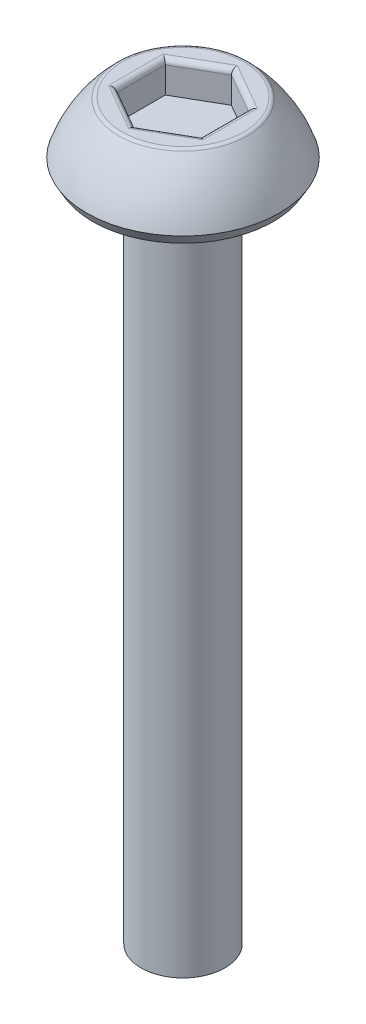
ISO-10303-21;
HEADER;
FILE_DESCRIPTION(('STEP AP214'),'2;1');
FILE_NAME('part.step','',(''),(''),'','','');
FILE_SCHEMA(('AUTOMOTIVE_DESIGN { 1 0 10303 214 1 1 1 1 }'));
ENDSEC;
DATA;
#1=APPLICATION_CONTEXT('core data for automotive mechanical design processes');
#2=APPLICATION_PROTOCOL_DEFINITION('international standard','automotive_design',2000,#1);
#3=PRODUCT_CONTEXT('',#1,'mechanical');
#4=PRODUCT('Part','Part','',(#3));
#5=PRODUCT_RELATED_PRODUCT_CATEGORY('part','',(#4));
#6=PRODUCT_DEFINITION_FORMATION('','',#4);
#7=PRODUCT_DEFINITION_CONTEXT('part definition',#1,'design');
#8=PRODUCT_DEFINITION('design','',#6,#7);
#9=PRODUCT_DEFINITION_SHAPE('','',#8);
#10=(LENGTH_UNIT() NAMED_UNIT(*) SI_UNIT(.MILLI.,.METRE.));
#11=(NAMED_UNIT(*) PLANE_ANGLE_UNIT() SI_UNIT($,.RADIAN.));
#12=(NAMED_UNIT(*) SI_UNIT($,.STERADIAN.) SOLID_ANGLE_UNIT());
#13=UNCERTAINTY_MEASURE_WITH_UNIT(LENGTH_MEASURE(1.E-05),#10,'distance_accuracy_value','');
#14=(GEOMETRIC_REPRESENTATION_CONTEXT(3) GLOBAL_UNCERTAINTY_ASSIGNED_CONTEXT((#13)) GLOBAL_UNIT_ASSIGNED_CONTEXT((#10,
#11,#12)) REPRESENTATION_CONTEXT('',''));
#15=CARTESIAN_POINT('',(0.,0.,0.));
#16=DIRECTION('',(0.,0.,1.));
#17=DIRECTION('',(1.,0.,0.));
#18=AXIS2_PLACEMENT_3D('',#15,#16,#17);
#19=CARTESIAN_POINT('',(0.,1.5,0.));
#20=DIRECTION('',(0.,-1.,0.));
#21=DIRECTION('',(0.,0.,-1.));
#22=AXIS2_PLACEMENT_3D('',#19,#20,#21);
#23=PLANE('',#22);
#24=CARTESIAN_POINT('',(0.,1.5,0.));
#25=DIRECTION('',(0.,-1.,0.));
#26=DIRECTION('',(0.,0.,-1.));
#27=AXIS2_PLACEMENT_3D('',#24,#25,#26);
#28=CIRCLE('',#27,1.45007695941143);
#29=CARTESIAN_POINT('',(0.,1.5,-1.45007695941143));
#30=VERTEX_POINT('',#29);
#31=EDGE_CURVE('E177',#30,#30,#28,.F.);
#32=ORIENTED_EDGE('',*,*,#31,.T.);
#33=EDGE_LOOP('',(#32));
#34=FACE_BOUND('',#33,.T.);
#35=DIRECTION('',(0.866025403784439,0.,-0.5));
#36=VECTOR('',#35,1.);
#37=CARTESIAN_POINT('',(0.5625,1.5,0.974278579257493));
#38=LINE('',#37,#36);
#39=CARTESIAN_POINT('',(1.125,1.5,0.649519052838329));
#40=VERTEX_POINT('',#39);
#41=CARTESIAN_POINT('',(0.,1.5,1.29903810567666));
#42=VERTEX_POINT('',#41);
#43=EDGE_CURVE('E172',#40,#42,#38,.F.);
#44=ORIENTED_EDGE('',*,*,#43,.T.);
#45=DIRECTION('',(0.866025403784439,0.,0.5));
#46=VECTOR('',#45,1.);
#47=CARTESIAN_POINT('',(-0.5625,1.5,0.974278579257493));
#48=LINE('',#47,#46);
#49=CARTESIAN_POINT('',(-1.125,1.5,0.649519052838329));
#50=VERTEX_POINT('',#49);
#51=EDGE_CURVE('E174',#42,#50,#48,.F.);
#52=ORIENTED_EDGE('',*,*,#51,.T.);
#53=DIRECTION('',(0.,0.,1.));
#54=VECTOR('',#53,1.);
#55=CARTESIAN_POINT('',(-1.125,1.5,0.));
#56=LINE('',#55,#54);
#57=CARTESIAN_POINT('',(-1.125,1.5,-0.649519052838329));
#58=VERTEX_POINT('',#57);
#59=EDGE_CURVE('E164',#50,#58,#56,.F.);
#60=ORIENTED_EDGE('',*,*,#59,.T.);
#61=DIRECTION('',(-0.866025403784439,0.,0.5));
#62=VECTOR('',#61,1.);
#63=CARTESIAN_POINT('',(-0.5625,1.5,-0.974278579257493));
#64=LINE('',#63,#62);
#65=CARTESIAN_POINT('',(0.,1.5,-1.29903810567666));
#66=VERTEX_POINT('',#65);
#67=EDGE_CURVE('E166',#58,#66,#64,.F.);
#68=ORIENTED_EDGE('',*,*,#67,.T.);
#69=DIRECTION('',(-0.866025403784439,0.,-0.5));
#70=VECTOR('',#69,1.);
#71=CARTESIAN_POINT('',(0.5625,1.5,-0.974278579257494));
#72=LINE('',#71,#70);
#73=CARTESIAN_POINT('',(1.125,1.5,-0.64951905283833));
#74=VERTEX_POINT('',#73);
#75=EDGE_CURVE('E168',#66,#74,#72,.F.);
#76=ORIENTED_EDGE('',*,*,#75,.T.);
#77=DIRECTION('',(0.,0.,-1.));
#78=VECTOR('',#77,1.);
#79=CARTESIAN_POINT('',(1.125,1.5,0.));
#80=LINE('',#79,#78);
#81=EDGE_CURVE('E170',#74,#40,#80,.F.);
#82=ORIENTED_EDGE('',*,*,#81,.T.);
#83=EDGE_LOOP('',(#44,#52,#60,#68,#76,#82));
#84=FACE_BOUND('',#83,.T.);
#85=ADVANCED_FACE('F35',(#34,#84),#23,.F.);
#86=CARTESIAN_POINT('',(0.,-0.691910970237067,0.));
#87=DIRECTION('',(0.,-1.,0.));
#88=DIRECTION('',(0.,0.,-1.));
#89=AXIS2_PLACEMENT_3D('',#86,#87,#88);
#90=DEGENERATE_TOROIDAL_SURFACE('',#89,0.548298390995416,3.,.F.);
#91=CARTESIAN_POINT('',(0.,1.46486569435813,0.));
#92=DIRECTION('',(0.,-1.,0.));
#93=DIRECTION('',(0.,0.,-1.));
#94=AXIS2_PLACEMENT_3D('',#91,#92,#93);
#95=CIRCLE('',#94,1.53696284421173);
#96=CARTESIAN_POINT('',(0.,1.46486569435813,-1.53696284421173));
#97=VERTEX_POINT('',#96);
#98=EDGE_CURVE('E161',#97,#97,#95,.T.);
#99=ORIENTED_EDGE('',*,*,#98,.T.);
#100=EDGE_LOOP('',(#99));
#101=FACE_BOUND('',#100,.T.);
#102=CARTESIAN_POINT('',(0.,0.25,0.));
#103=DIRECTION('',(0.,-1.,0.));
#104=DIRECTION('',(0.,0.,-1.));
#105=AXIS2_PLACEMENT_3D('',#102,#103,#104);
#106=CIRCLE('',#105,2.3);
#107=CARTESIAN_POINT('',(0.,0.25,-2.3));
#108=VERTEX_POINT('',#107);
#109=EDGE_CURVE('E158',#108,#108,#106,.T.);
#110=ORIENTED_EDGE('',*,*,#109,.F.);
#111=EDGE_LOOP('',(#110));
#112=FACE_BOUND('',#111,.T.);
#113=ADVANCED_FACE('F244',(#101,#112),#90,.F.);
#114=CARTESIAN_POINT('',(0.,0.25,0.));
#115=DIRECTION('',(0.,1.,0.));
#116=DIRECTION('',(0.,0.,1.));
#117=AXIS2_PLACEMENT_3D('',#114,#115,#116);
#118=CONICAL_SURFACE('',#117,2.3,0.523598775598296);
#119=CARTESIAN_POINT('',(0.,0.,0.));
#120=DIRECTION('',(0.,-1.,0.));
#121=DIRECTION('',(0.,0.,-1.));
#122=AXIS2_PLACEMENT_3D('',#119,#120,#121);
#123=CIRCLE('',#122,2.15566243270259);
#124=CARTESIAN_POINT('',(0.,0.,-2.15566243270259));
#125=VERTEX_POINT('',#124);
#126=EDGE_CURVE('E155',#125,#125,#123,.T.);
#127=ORIENTED_EDGE('',*,*,#126,.F.);
#128=EDGE_LOOP('',(#127));
#129=FACE_BOUND('',#128,.T.);
#130=ORIENTED_EDGE('',*,*,#109,.T.);
#131=EDGE_LOOP('',(#130));
#132=FACE_BOUND('',#131,.T.);
#133=ADVANCED_FACE('F250',(#129,#132),#118,.T.);
#134=CARTESIAN_POINT('',(0.,0.,2.15566243270259));
#135=DIRECTION('',(0.,1.,0.));
#136=DIRECTION('',(0.,0.,1.));
#137=AXIS2_PLACEMENT_3D('',#134,#135,#136);
#138=PLANE('',#137);
#139=CARTESIAN_POINT('',(0.,0.,0.));
#140=DIRECTION('',(0.,-1.,0.));
#141=DIRECTION('',(0.,0.,-1.));
#142=AXIS2_PLACEMENT_3D('',#139,#140,#141);
#143=CIRCLE('',#142,1.);
#144=CARTESIAN_POINT('',(0.,0.,-1.));
#145=VERTEX_POINT('',#144);
#146=EDGE_CURVE('E152',#145,#145,#143,.T.);
#147=ORIENTED_EDGE('',*,*,#146,.F.);
#148=EDGE_LOOP('',(#147));
#149=FACE_BOUND('',#148,.T.);
#150=ORIENTED_EDGE('',*,*,#126,.T.);
#151=EDGE_LOOP('',(#150));
#152=FACE_BOUND('',#151,.T.);
#153=ADVANCED_FACE('F269',(#149,#152),#138,.F.);
#154=CARTESIAN_POINT('',(0.,-16.,0.));
#155=DIRECTION('',(0.,-1.,0.));
#156=DIRECTION('',(0.,0.,-1.));
#157=AXIS2_PLACEMENT_3D('',#154,#155,#156);
#158=CYLINDRICAL_SURFACE('',#157,0.999999999999999);
#159=CARTESIAN_POINT('',(0.,-16.,0.));
#160=DIRECTION('',(0.,-1.,0.));
#161=DIRECTION('',(0.,0.,-1.));
#162=AXIS2_PLACEMENT_3D('',#159,#160,#161);
#163=CIRCLE('',#162,0.999999999999998);
#164=CARTESIAN_POINT('',(0.,-16.,-0.999999999999998));
#165=VERTEX_POINT('',#164);
#166=EDGE_CURVE('E139',#165,#165,#163,.T.);
#167=ORIENTED_EDGE('',*,*,#166,.F.);
#168=EDGE_LOOP('',(#167));
#169=FACE_BOUND('',#168,.T.);
#170=ORIENTED_EDGE('',*,*,#146,.T.);
#171=EDGE_LOOP('',(#170));
#172=FACE_BOUND('',#171,.T.);
#173=ADVANCED_FACE('F274',(#169,#172),#158,.T.);
#174=CARTESIAN_POINT('',(0.,-16.,0.999999999999998));
#175=DIRECTION('',(0.,1.,0.));
#176=DIRECTION('',(0.,0.,1.));
#177=AXIS2_PLACEMENT_3D('',#174,#175,#176);
#178=PLANE('',#177);
#179=ORIENTED_EDGE('',*,*,#166,.T.);
#180=EDGE_LOOP('',(#179));
#181=FACE_BOUND('',#180,.T.);
#182=ADVANCED_FACE('F281',(#181),#178,.F.);
#183=CARTESIAN_POINT('',(0.999999999999999,0.75,-0.577350269189626));
#184=DIRECTION('',(0.5,0.,-0.866025403784439));
#185=DIRECTION('',(-0.866025403784439,0.,-0.5));
#186=AXIS2_PLACEMENT_3D('',#183,#184,#185);
#187=PLANE('',#186);
#188=DIRECTION('',(0.,1.,0.));
#189=VECTOR('',#188,1.);
#190=CARTESIAN_POINT('',(0.999999999999999,0.75,-0.577350269189626));
#191=LINE('',#190,#189);
#192=CARTESIAN_POINT('',(0.999999999999999,0.75,-0.577350269189626));
#193=VERTEX_POINT('',#192);
#194=CARTESIAN_POINT('',(0.999999999999999,1.375,-0.577350269189626));
#195=VERTEX_POINT('',#194);
#196=EDGE_CURVE('E137',#193,#195,#191,.T.);
#197=ORIENTED_EDGE('',*,*,#196,.T.);
#198=DIRECTION('',(-0.866025403784439,0.,-0.5));
#199=VECTOR('',#198,1.);
#200=CARTESIAN_POINT('',(0.999999999999999,1.375,-0.577350269189626));
#201=LINE('',#200,#199);
#202=CARTESIAN_POINT('',(0.,1.375,-1.15470053837925));
#203=VERTEX_POINT('',#202);
#204=EDGE_CURVE('E59',#195,#203,#201,.T.);
#205=ORIENTED_EDGE('',*,*,#204,.T.);
#206=DIRECTION('',(0.,1.,0.));
#207=VECTOR('',#206,1.);
#208=CARTESIAN_POINT('',(0.,0.75,-1.15470053837925));
#209=LINE('',#208,#207);
#210=CARTESIAN_POINT('',(0.,0.75,-1.15470053837925));
#211=VERTEX_POINT('',#210);
#212=EDGE_CURVE('E105',#211,#203,#209,.T.);
#213=ORIENTED_EDGE('',*,*,#212,.F.);
#214=DIRECTION('',(-0.866025403784439,0.,-0.5));
#215=VECTOR('',#214,1.);
#216=CARTESIAN_POINT('',(0.999999999999999,0.75,-0.577350269189626));
#217=LINE('',#216,#215);
#218=EDGE_CURVE('E109',#193,#211,#217,.T.);
#219=ORIENTED_EDGE('',*,*,#218,.F.);
#220=EDGE_LOOP('',(#197,#205,#213,#219));
#221=FACE_BOUND('',#220,.T.);
#222=ADVANCED_FACE('F107',(#221),#187,.F.);
#223=CARTESIAN_POINT('',(1.,0.75,0.577350269189626));
#224=DIRECTION('',(1.,0.,0.));
#225=DIRECTION('',(0.,0.,-1.));
#226=AXIS2_PLACEMENT_3D('',#223,#224,#225);
#227=PLANE('',#226);
#228=DIRECTION('',(0.,1.,0.));
#229=VECTOR('',#228,1.);
#230=CARTESIAN_POINT('',(1.,0.75,0.577350269189626));
#231=LINE('',#230,#229);
#232=CARTESIAN_POINT('',(1.,0.75,0.577350269189626));
#233=VERTEX_POINT('',#232);
#234=CARTESIAN_POINT('',(1.,1.375,0.577350269189626));
#235=VERTEX_POINT('',#234);
#236=EDGE_CURVE('E140',#233,#235,#231,.T.);
#237=ORIENTED_EDGE('',*,*,#236,.T.);
#238=DIRECTION('',(0.,0.,-1.));
#239=VECTOR('',#238,1.);
#240=CARTESIAN_POINT('',(1.,1.375,0.577350269189626));
#241=LINE('',#240,#239);
#242=EDGE_CURVE('E185',#235,#195,#241,.T.);
#243=ORIENTED_EDGE('',*,*,#242,.T.);
#244=ORIENTED_EDGE('',*,*,#196,.F.);
#245=DIRECTION('',(0.,0.,-1.));
#246=VECTOR('',#245,1.);
#247=CARTESIAN_POINT('',(1.,0.75,0.577350269189626));
#248=LINE('',#247,#246);
#249=EDGE_CURVE('E113',#233,#193,#248,.T.);
#250=ORIENTED_EDGE('',*,*,#249,.F.);
#251=EDGE_LOOP('',(#237,#243,#244,#250));
#252=FACE_BOUND('',#251,.T.);
#253=ADVANCED_FACE('F225',(#252),#227,.F.);
#254=CARTESIAN_POINT('',(0.,0.75,1.15470053837925));
#255=DIRECTION('',(0.5,0.,0.866025403784439));
#256=DIRECTION('',(0.866025403784439,0.,-0.5));
#257=AXIS2_PLACEMENT_3D('',#254,#255,#256);
#258=PLANE('',#257);
#259=DIRECTION('',(0.,1.,0.));
#260=VECTOR('',#259,1.);
#261=CARTESIAN_POINT('',(0.,0.75,1.15470053837925));
#262=LINE('',#261,#260);
#263=CARTESIAN_POINT('',(0.,0.75,1.15470053837925));
#264=VERTEX_POINT('',#263);
#265=CARTESIAN_POINT('',(0.,1.375,1.15470053837925));
#266=VERTEX_POINT('',#265);
#267=EDGE_CURVE('E143',#264,#266,#262,.T.);
#268=ORIENTED_EDGE('',*,*,#267,.T.);
#269=DIRECTION('',(0.866025403784439,0.,-0.5));
#270=VECTOR('',#269,1.);
#271=CARTESIAN_POINT('',(0.,1.375,1.15470053837925));
#272=LINE('',#271,#270);
#273=EDGE_CURVE('E183',#266,#235,#272,.T.);
#274=ORIENTED_EDGE('',*,*,#273,.T.);
#275=ORIENTED_EDGE('',*,*,#236,.F.);
#276=DIRECTION('',(0.866025403784439,0.,-0.5));
#277=VECTOR('',#276,1.);
#278=CARTESIAN_POINT('',(0.,0.75,1.15470053837925));
#279=LINE('',#278,#277);
#280=EDGE_CURVE('E134',#264,#233,#279,.T.);
#281=ORIENTED_EDGE('',*,*,#280,.F.);
#282=EDGE_LOOP('',(#268,#274,#275,#281));
#283=FACE_BOUND('',#282,.T.);
#284=ADVANCED_FACE('F226',(#283),#258,.F.);
#285=CARTESIAN_POINT('',(-0.999999999999999,0.75,0.577350269189626));
#286=DIRECTION('',(-0.5,0.,0.866025403784439));
#287=DIRECTION('',(0.866025403784439,0.,0.5));
#288=AXIS2_PLACEMENT_3D('',#285,#286,#287);
#289=PLANE('',#288);
#290=DIRECTION('',(0.,1.,0.));
#291=VECTOR('',#290,1.);
#292=CARTESIAN_POINT('',(-0.999999999999999,0.75,0.577350269189626));
#293=LINE('',#292,#291);
#294=CARTESIAN_POINT('',(-0.999999999999999,0.75,0.577350269189626));
#295=VERTEX_POINT('',#294);
#296=CARTESIAN_POINT('',(-0.999999999999999,1.375,0.577350269189626));
#297=VERTEX_POINT('',#296);
#298=EDGE_CURVE('E146',#295,#297,#293,.T.);
#299=ORIENTED_EDGE('',*,*,#298,.T.);
#300=DIRECTION('',(0.866025403784439,0.,0.5));
#301=VECTOR('',#300,1.);
#302=CARTESIAN_POINT('',(-0.999999999999999,1.375,0.577350269189626));
#303=LINE('',#302,#301);
#304=EDGE_CURVE('E180',#297,#266,#303,.T.);
#305=ORIENTED_EDGE('',*,*,#304,.T.);
#306=ORIENTED_EDGE('',*,*,#267,.F.);
#307=DIRECTION('',(0.866025403784439,0.,0.5));
#308=VECTOR('',#307,1.);
#309=CARTESIAN_POINT('',(-0.999999999999999,0.75,0.577350269189626));
#310=LINE('',#309,#308);
#311=EDGE_CURVE('E131',#295,#264,#310,.T.);
#312=ORIENTED_EDGE('',*,*,#311,.F.);
#313=EDGE_LOOP('',(#299,#305,#306,#312));
#314=FACE_BOUND('',#313,.T.);
#315=ADVANCED_FACE('F221',(#314),#289,.F.);
#316=CARTESIAN_POINT('',(-1.,0.75,-0.577350269189626));
#317=DIRECTION('',(-1.,0.,0.));
#318=DIRECTION('',(0.,0.,1.));
#319=AXIS2_PLACEMENT_3D('',#316,#317,#318);
#320=PLANE('',#319);
#321=DIRECTION('',(0.,1.,0.));
#322=VECTOR('',#321,1.);
#323=CARTESIAN_POINT('',(-1.,0.75,-0.577350269189626));
#324=LINE('',#323,#322);
#325=CARTESIAN_POINT('',(-1.,0.75,-0.577350269189626));
#326=VERTEX_POINT('',#325);
#327=CARTESIAN_POINT('',(-1.,1.375,-0.577350269189626));
#328=VERTEX_POINT('',#327);
#329=EDGE_CURVE('E112',#326,#328,#324,.T.);
#330=ORIENTED_EDGE('',*,*,#329,.T.);
#331=DIRECTION('',(0.,0.,1.));
#332=VECTOR('',#331,1.);
#333=CARTESIAN_POINT('',(-1.,1.375,-0.577350269189626));
#334=LINE('',#333,#332);
#335=EDGE_CURVE('E11',#328,#297,#334,.T.);
#336=ORIENTED_EDGE('',*,*,#335,.T.);
#337=ORIENTED_EDGE('',*,*,#298,.F.);
#338=DIRECTION('',(0.,0.,1.));
#339=VECTOR('',#338,1.);
#340=CARTESIAN_POINT('',(-1.,0.75,-0.577350269189626));
#341=LINE('',#340,#339);
#342=EDGE_CURVE('E121',#326,#295,#341,.T.);
#343=ORIENTED_EDGE('',*,*,#342,.F.);
#344=EDGE_LOOP('',(#330,#336,#337,#343));
#345=FACE_BOUND('',#344,.T.);
#346=ADVANCED_FACE('F218',(#345),#320,.F.);
#347=CARTESIAN_POINT('',(0.,0.75,-1.15470053837925));
#348=DIRECTION('',(-0.5,0.,-0.866025403784438));
#349=DIRECTION('',(-0.866025403784439,0.,0.5));
#350=AXIS2_PLACEMENT_3D('',#347,#348,#349);
#351=PLANE('',#350);
#352=ORIENTED_EDGE('',*,*,#212,.T.);
#353=DIRECTION('',(-0.866025403784439,0.,0.5));
#354=VECTOR('',#353,1.);
#355=CARTESIAN_POINT('',(0.,1.375,-1.15470053837925));
#356=LINE('',#355,#354);
#357=EDGE_CURVE('E44',#203,#328,#356,.T.);
#358=ORIENTED_EDGE('',*,*,#357,.T.);
#359=ORIENTED_EDGE('',*,*,#329,.F.);
#360=DIRECTION('',(-0.866025403784439,0.,0.5));
#361=VECTOR('',#360,1.);
#362=CARTESIAN_POINT('',(0.,0.75,-1.15470053837925));
#363=LINE('',#362,#361);
#364=EDGE_CURVE('E116',#211,#326,#363,.T.);
#365=ORIENTED_EDGE('',*,*,#364,.F.);
#366=EDGE_LOOP('',(#352,#358,#359,#365));
#367=FACE_BOUND('',#366,.T.);
#368=ADVANCED_FACE('F117',(#367),#351,.F.);
#369=CARTESIAN_POINT('',(0.,0.75,0.));
#370=DIRECTION('',(0.,1.,0.));
#371=DIRECTION('',(0.,0.,1.));
#372=AXIS2_PLACEMENT_3D('',#369,#370,#371);
#373=PLANE('',#372);
#374=ORIENTED_EDGE('',*,*,#218,.T.);
#375=ORIENTED_EDGE('',*,*,#364,.T.);
#376=ORIENTED_EDGE('',*,*,#342,.T.);
#377=ORIENTED_EDGE('',*,*,#311,.T.);
#378=ORIENTED_EDGE('',*,*,#280,.T.);
#379=ORIENTED_EDGE('',*,*,#249,.T.);
#380=EDGE_LOOP('',(#374,#375,#376,#377,#378,#379));
#381=FACE_BOUND('',#380,.T.);
#382=ADVANCED_FACE('F123',(#381),#373,.T.);
#383=CARTESIAN_POINT('',(0.,1.375,0.));
#384=DIRECTION('',(0.,-1.,0.));
#385=DIRECTION('',(0.,0.,-1.));
#386=AXIS2_PLACEMENT_3D('',#383,#384,#385);
#387=TOROIDAL_SURFACE('',#386,1.45007695941143,0.125);
#388=ORIENTED_EDGE('',*,*,#31,.F.);
#389=EDGE_LOOP('',(#388));
#390=FACE_BOUND('',#389,.T.);
#391=ORIENTED_EDGE('',*,*,#98,.F.);
#392=EDGE_LOOP('',(#391));
#393=FACE_BOUND('',#392,.T.);
#394=ADVANCED_FACE('F254',(#390,#393),#387,.T.);
#395=CARTESIAN_POINT('',(1.0625,1.375,-0.685603444662681));
#396=DIRECTION('',(-0.866025403784439,0.,-0.5));
#397=DIRECTION('',(-0.5,0.,0.866025403784439));
#398=AXIS2_PLACEMENT_3D('',#395,#396,#397);
#399=CYLINDRICAL_SURFACE('',#398,0.125);
#400=CARTESIAN_POINT('',(1.125,1.375,-0.64951905283833));
#401=DIRECTION('',(-0.5,0.,-0.866025403784438));
#402=DIRECTION('',(0.866025403784439,0.,-0.5));
#403=AXIS2_PLACEMENT_3D('',#400,#401,#402);
#404=ELLIPSE('',#403,0.144337567297406,0.125);
#405=EDGE_CURVE('E128',#74,#195,#404,.F.);
#406=ORIENTED_EDGE('',*,*,#405,.F.);
#407=ORIENTED_EDGE('',*,*,#75,.F.);
#408=CARTESIAN_POINT('',(0.,1.375,-1.29903810567666));
#409=DIRECTION('',(-1.,0.,0.));
#410=DIRECTION('',(0.,0.,-1.));
#411=AXIS2_PLACEMENT_3D('',#408,#409,#410);
#412=ELLIPSE('',#411,0.144337567297406,0.125);
#413=EDGE_CURVE('E39',#203,#66,#412,.T.);
#414=ORIENTED_EDGE('',*,*,#413,.F.);
#415=ORIENTED_EDGE('',*,*,#204,.F.);
#416=EDGE_LOOP('',(#406,#407,#414,#415));
#417=FACE_BOUND('',#416,.T.);
#418=ADVANCED_FACE('F37',(#417),#399,.T.);
#419=CARTESIAN_POINT('',(-0.0625000000000002,1.375,-1.26295371385231));
#420=DIRECTION('',(-0.866025403784439,0.,0.5));
#421=DIRECTION('',(0.5,0.,0.866025403784439));
#422=AXIS2_PLACEMENT_3D('',#419,#420,#421);
#423=CYLINDRICAL_SURFACE('',#422,0.125);
#424=ORIENTED_EDGE('',*,*,#413,.T.);
#425=ORIENTED_EDGE('',*,*,#67,.F.);
#426=CARTESIAN_POINT('',(-1.125,1.375,-0.649519052838329));
#427=DIRECTION('',(-0.5,0.,0.866025403784439));
#428=DIRECTION('',(-0.866025403784439,0.,-0.5));
#429=AXIS2_PLACEMENT_3D('',#426,#427,#428);
#430=ELLIPSE('',#429,0.144337567297406,0.125);
#431=EDGE_CURVE('E196',#328,#58,#430,.T.);
#432=ORIENTED_EDGE('',*,*,#431,.F.);
#433=ORIENTED_EDGE('',*,*,#357,.F.);
#434=EDGE_LOOP('',(#424,#425,#432,#433));
#435=FACE_BOUND('',#434,.T.);
#436=ADVANCED_FACE('F210',(#435),#423,.T.);
#437=CARTESIAN_POINT('',(1.125,1.375,0.577350269189626));
#438=DIRECTION('',(0.,0.,-1.));
#439=DIRECTION('',(-1.,0.,0.));
#440=AXIS2_PLACEMENT_3D('',#437,#438,#439);
#441=CYLINDRICAL_SURFACE('',#440,0.125);
#442=ORIENTED_EDGE('',*,*,#405,.T.);
#443=ORIENTED_EDGE('',*,*,#242,.F.);
#444=CARTESIAN_POINT('',(1.125,1.375,0.649519052838329));
#445=DIRECTION('',(0.5,0.,-0.866025403784439));
#446=DIRECTION('',(0.866025403784439,0.,0.5));
#447=AXIS2_PLACEMENT_3D('',#444,#445,#446);
#448=ELLIPSE('',#447,0.144337567297406,0.125);
#449=EDGE_CURVE('E193',#40,#235,#448,.F.);
#450=ORIENTED_EDGE('',*,*,#449,.F.);
#451=ORIENTED_EDGE('',*,*,#81,.F.);
#452=EDGE_LOOP('',(#442,#443,#450,#451));
#453=FACE_BOUND('',#452,.T.);
#454=ADVANCED_FACE('F203',(#453),#441,.T.);
#455=CARTESIAN_POINT('',(-1.125,1.375,-0.577350269189626));
#456=DIRECTION('',(0.,0.,1.));
#457=DIRECTION('',(1.,0.,0.));
#458=AXIS2_PLACEMENT_3D('',#455,#456,#457);
#459=CYLINDRICAL_SURFACE('',#458,0.125);
#460=ORIENTED_EDGE('',*,*,#431,.T.);
#461=ORIENTED_EDGE('',*,*,#59,.F.);
#462=CARTESIAN_POINT('',(-1.125,1.375,0.649519052838329));
#463=DIRECTION('',(0.5,0.,0.866025403784438));
#464=DIRECTION('',(0.866025403784439,0.,-0.5));
#465=AXIS2_PLACEMENT_3D('',#462,#463,#464);
#466=ELLIPSE('',#465,0.144337567297406,0.125);
#467=EDGE_CURVE('E191',#297,#50,#466,.T.);
#468=ORIENTED_EDGE('',*,*,#467,.F.);
#469=ORIENTED_EDGE('',*,*,#335,.F.);
#470=EDGE_LOOP('',(#460,#461,#468,#469));
#471=FACE_BOUND('',#470,.T.);
#472=ADVANCED_FACE('F215',(#471),#459,.T.);
#473=CARTESIAN_POINT('',(0.0625000000000004,1.375,1.26295371385231));
#474=DIRECTION('',(0.866025403784439,0.,-0.5));
#475=DIRECTION('',(-0.5,0.,-0.866025403784439));
#476=AXIS2_PLACEMENT_3D('',#473,#474,#475);
#477=CYLINDRICAL_SURFACE('',#476,0.125);
#478=ORIENTED_EDGE('',*,*,#449,.T.);
#479=ORIENTED_EDGE('',*,*,#273,.F.);
#480=CARTESIAN_POINT('',(0.,1.375,1.29903810567666));
#481=DIRECTION('',(1.,0.,0.));
#482=DIRECTION('',(0.,0.,1.));
#483=AXIS2_PLACEMENT_3D('',#480,#481,#482);
#484=ELLIPSE('',#483,0.144337567297406,0.125);
#485=EDGE_CURVE('E189',#42,#266,#484,.F.);
#486=ORIENTED_EDGE('',*,*,#485,.F.);
#487=ORIENTED_EDGE('',*,*,#43,.F.);
#488=EDGE_LOOP('',(#478,#479,#486,#487));
#489=FACE_BOUND('',#488,.T.);
#490=ADVANCED_FACE('F230',(#489),#477,.T.);
#491=CARTESIAN_POINT('',(-1.0625,1.375,0.685603444662681));
#492=DIRECTION('',(0.866025403784439,0.,0.5));
#493=DIRECTION('',(0.5,0.,-0.866025403784439));
#494=AXIS2_PLACEMENT_3D('',#491,#492,#493);
#495=CYLINDRICAL_SURFACE('',#494,0.125);
#496=ORIENTED_EDGE('',*,*,#467,.T.);
#497=ORIENTED_EDGE('',*,*,#51,.F.);
#498=ORIENTED_EDGE('',*,*,#485,.T.);
#499=ORIENTED_EDGE('',*,*,#304,.F.);
#500=EDGE_LOOP('',(#496,#497,#498,#499));
#501=FACE_BOUND('',#500,.T.);
#502=ADVANCED_FACE('F235',(#501),#495,.T.);
#503=CLOSED_SHELL('',(#85,#113,#133,#153,#173,#182,#222,#253,#284,#315,#346,#368,#382,#394,#418,
#436,#454,#472,#490,#502));
#504=MANIFOLD_SOLID_BREP('B2',#503);
#505=ADVANCED_BREP_SHAPE_REPRESENTATION('',(#18,#504),#14);
#506=SHAPE_DEFINITION_REPRESENTATION(#9,#505);
ENDSEC;
END-ISO-10303-21;
